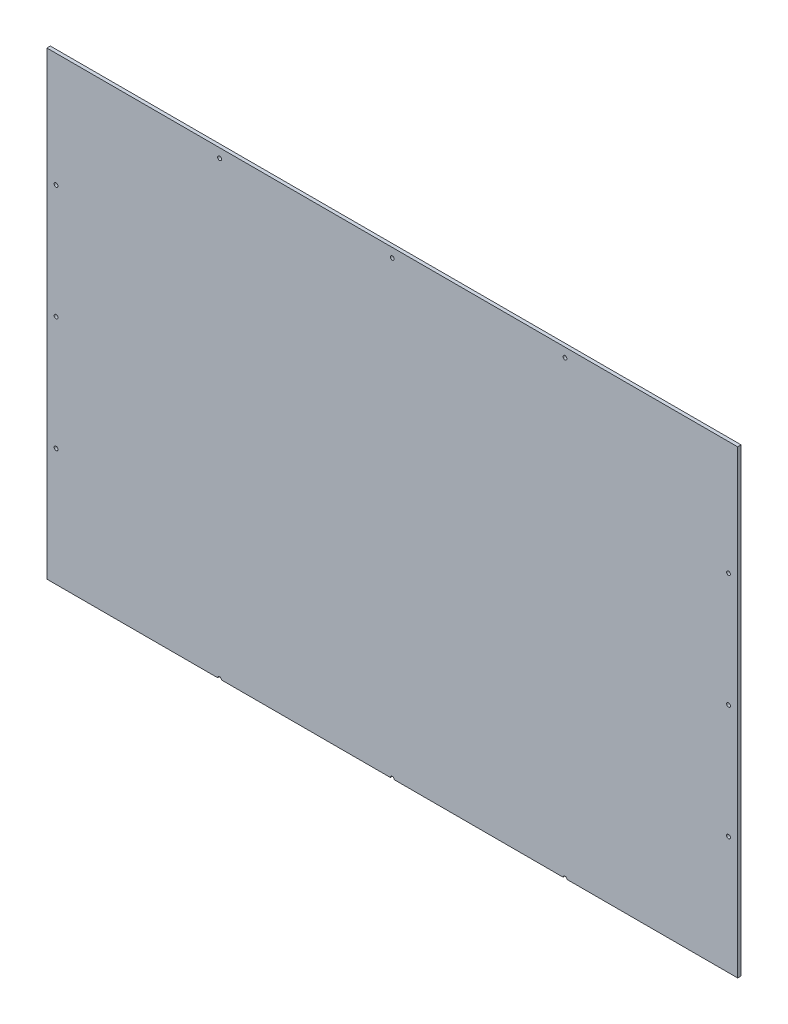
ISO-10303-21;
HEADER;
FILE_DESCRIPTION(('STEP AP214'),'2;1');
FILE_NAME('part.step','',(''),(''),'','','');
FILE_SCHEMA(('AUTOMOTIVE_DESIGN { 1 0 10303 214 1 1 1 1 }'));
ENDSEC;
DATA;
#1=APPLICATION_CONTEXT('core data for automotive mechanical design processes');
#2=APPLICATION_PROTOCOL_DEFINITION('international standard','automotive_design',2000,#1);
#3=PRODUCT_CONTEXT('',#1,'mechanical');
#4=PRODUCT('Part','Part','',(#3));
#5=PRODUCT_RELATED_PRODUCT_CATEGORY('part','',(#4));
#6=PRODUCT_DEFINITION_FORMATION('','',#4);
#7=PRODUCT_DEFINITION_CONTEXT('part definition',#1,'design');
#8=PRODUCT_DEFINITION('design','',#6,#7);
#9=PRODUCT_DEFINITION_SHAPE('','',#8);
#10=(LENGTH_UNIT() NAMED_UNIT(*) SI_UNIT(.MILLI.,.METRE.));
#11=(NAMED_UNIT(*) PLANE_ANGLE_UNIT() SI_UNIT($,.RADIAN.));
#12=(NAMED_UNIT(*) SI_UNIT($,.STERADIAN.) SOLID_ANGLE_UNIT());
#13=UNCERTAINTY_MEASURE_WITH_UNIT(LENGTH_MEASURE(1.E-05),#10,'distance_accuracy_value','');
#14=(GEOMETRIC_REPRESENTATION_CONTEXT(3) GLOBAL_UNCERTAINTY_ASSIGNED_CONTEXT((#13)) GLOBAL_UNIT_ASSIGNED_CONTEXT((#10,
#11,#12)) REPRESENTATION_CONTEXT('',''));
#15=CARTESIAN_POINT('',(0.,0.,0.));
#16=DIRECTION('',(0.,0.,1.));
#17=DIRECTION('',(1.,0.,0.));
#18=AXIS2_PLACEMENT_3D('',#15,#16,#17);
#19=CARTESIAN_POINT('',(-452.,298.5,4.5));
#20=DIRECTION('',(1.,0.,0.));
#21=DIRECTION('',(0.,1.,0.));
#22=AXIS2_PLACEMENT_3D('',#19,#20,#21);
#23=PLANE('',#22);
#24=DIRECTION('',(0.,-1.,0.));
#25=VECTOR('',#24,1.);
#26=CARTESIAN_POINT('',(-452.,298.5,0.));
#27=LINE('',#26,#25);
#28=CARTESIAN_POINT('',(-452.,298.5,0.));
#29=VERTEX_POINT('',#28);
#30=CARTESIAN_POINT('',(-452.,-303.5,0.));
#31=VERTEX_POINT('',#30);
#32=EDGE_CURVE('E154',#29,#31,#27,.T.);
#33=ORIENTED_EDGE('',*,*,#32,.T.);
#34=DIRECTION('',(0.,0.,-1.));
#35=VECTOR('',#34,1.);
#36=CARTESIAN_POINT('',(-452.,-303.5,4.5));
#37=LINE('',#36,#35);
#38=CARTESIAN_POINT('',(-452.,-303.5,4.5));
#39=VERTEX_POINT('',#38);
#40=EDGE_CURVE('E11',#39,#31,#37,.T.);
#41=ORIENTED_EDGE('',*,*,#40,.F.);
#42=DIRECTION('',(0.,-1.,0.));
#43=VECTOR('',#42,1.);
#44=CARTESIAN_POINT('',(-452.,298.5,4.5));
#45=LINE('',#44,#43);
#46=CARTESIAN_POINT('',(-452.,298.5,4.5));
#47=VERTEX_POINT('',#46);
#48=EDGE_CURVE('E190',#47,#39,#45,.T.);
#49=ORIENTED_EDGE('',*,*,#48,.F.);
#50=DIRECTION('',(0.,0.,-1.));
#51=VECTOR('',#50,1.);
#52=CARTESIAN_POINT('',(-452.,298.5,4.5));
#53=LINE('',#52,#51);
#54=EDGE_CURVE('E58',#47,#29,#53,.T.);
#55=ORIENTED_EDGE('',*,*,#54,.T.);
#56=EDGE_LOOP('',(#33,#41,#49,#55));
#57=FACE_BOUND('',#56,.T.);
#58=ADVANCED_FACE('F39',(#57),#23,.F.);
#59=CARTESIAN_POINT('',(-452.,-303.5,4.5));
#60=DIRECTION('',(0.,1.,0.));
#61=DIRECTION('',(-1.,0.,0.));
#62=AXIS2_PLACEMENT_3D('',#59,#60,#61);
#63=PLANE('',#62);
#64=DIRECTION('',(1.,0.,0.));
#65=VECTOR('',#64,1.);
#66=CARTESIAN_POINT('',(-452.,-303.5,0.));
#67=LINE('',#66,#65);
#68=CARTESIAN_POINT('',(-228.5,-303.500000000002,0.));
#69=VERTEX_POINT('',#68);
#70=EDGE_CURVE('E157',#31,#69,#67,.T.);
#71=ORIENTED_EDGE('',*,*,#70,.T.);
#72=DIRECTION('',(0.,0.,-1.));
#73=VECTOR('',#72,1.);
#74=CARTESIAN_POINT('',(-228.5,-303.500000000002,4.5));
#75=LINE('',#74,#73);
#76=CARTESIAN_POINT('',(-228.5,-303.500000000002,4.5));
#77=VERTEX_POINT('',#76);
#78=EDGE_CURVE('E49',#77,#69,#75,.T.);
#79=ORIENTED_EDGE('',*,*,#78,.F.);
#80=DIRECTION('',(1.,0.,0.));
#81=VECTOR('',#80,1.);
#82=CARTESIAN_POINT('',(-452.,-303.5,4.5));
#83=LINE('',#82,#81);
#84=EDGE_CURVE('E102',#39,#77,#83,.T.);
#85=ORIENTED_EDGE('',*,*,#84,.F.);
#86=ORIENTED_EDGE('',*,*,#40,.T.);
#87=EDGE_LOOP('',(#71,#79,#85,#86));
#88=FACE_BOUND('',#87,.T.);
#89=ADVANCED_FACE('F264',(#88),#63,.F.);
#90=CARTESIAN_POINT('',(-226.,-303.500000000002,4.5));
#91=DIRECTION('',(0.,0.,-1.));
#92=DIRECTION('',(-1.,0.,0.));
#93=AXIS2_PLACEMENT_3D('',#90,#91,#92);
#94=CYLINDRICAL_SURFACE('',#93,2.5);
#95=CARTESIAN_POINT('',(-226.,-303.500000000002,0.));
#96=DIRECTION('',(0.,0.,1.));
#97=DIRECTION('',(1.,0.,0.));
#98=AXIS2_PLACEMENT_3D('',#95,#96,#97);
#99=CIRCLE('',#98,2.5);
#100=CARTESIAN_POINT('',(-223.5,-303.5,0.));
#101=VERTEX_POINT('',#100);
#102=EDGE_CURVE('E161',#101,#69,#99,.T.);
#103=ORIENTED_EDGE('',*,*,#102,.F.);
#104=DIRECTION('',(0.,0.,-1.));
#105=VECTOR('',#104,1.);
#106=CARTESIAN_POINT('',(-223.5,-303.5,4.5));
#107=LINE('',#106,#105);
#108=CARTESIAN_POINT('',(-223.5,-303.5,4.5));
#109=VERTEX_POINT('',#108);
#110=EDGE_CURVE('E206',#109,#101,#107,.T.);
#111=ORIENTED_EDGE('',*,*,#110,.F.);
#112=CARTESIAN_POINT('',(-226.,-303.500000000002,4.5));
#113=DIRECTION('',(0.,0.,1.));
#114=DIRECTION('',(1.,0.,0.));
#115=AXIS2_PLACEMENT_3D('',#112,#113,#114);
#116=CIRCLE('',#115,2.5);
#117=EDGE_CURVE('E318',#109,#77,#116,.T.);
#118=ORIENTED_EDGE('',*,*,#117,.T.);
#119=ORIENTED_EDGE('',*,*,#78,.T.);
#120=EDGE_LOOP('',(#103,#111,#118,#119));
#121=FACE_BOUND('',#120,.T.);
#122=ADVANCED_FACE('F268',(#121),#94,.F.);
#123=CARTESIAN_POINT('',(-223.5,-303.5,4.5));
#124=DIRECTION('',(0.,1.,0.));
#125=DIRECTION('',(0.,0.,1.));
#126=AXIS2_PLACEMENT_3D('',#123,#124,#125);
#127=PLANE('',#126);
#128=DIRECTION('',(1.,0.,0.));
#129=VECTOR('',#128,1.);
#130=CARTESIAN_POINT('',(-223.5,-303.5,0.));
#131=LINE('',#130,#129);
#132=CARTESIAN_POINT('',(-2.5,-303.5,0.));
#133=VERTEX_POINT('',#132);
#134=EDGE_CURVE('E165',#101,#133,#131,.T.);
#135=ORIENTED_EDGE('',*,*,#134,.T.);
#136=DIRECTION('',(0.,0.,-1.));
#137=VECTOR('',#136,1.);
#138=CARTESIAN_POINT('',(-2.5,-303.5,4.5));
#139=LINE('',#138,#137);
#140=CARTESIAN_POINT('',(-2.5,-303.5,4.5));
#141=VERTEX_POINT('',#140);
#142=EDGE_CURVE('E203',#141,#133,#139,.T.);
#143=ORIENTED_EDGE('',*,*,#142,.F.);
#144=DIRECTION('',(1.,0.,0.));
#145=VECTOR('',#144,1.);
#146=CARTESIAN_POINT('',(-223.5,-303.5,4.5));
#147=LINE('',#146,#145);
#148=EDGE_CURVE('E313',#109,#141,#147,.T.);
#149=ORIENTED_EDGE('',*,*,#148,.F.);
#150=ORIENTED_EDGE('',*,*,#110,.T.);
#151=EDGE_LOOP('',(#135,#143,#149,#150));
#152=FACE_BOUND('',#151,.T.);
#153=ADVANCED_FACE('F296',(#152),#127,.F.);
#154=CARTESIAN_POINT('',(0.,-303.5,4.5));
#155=DIRECTION('',(0.,0.,-1.));
#156=DIRECTION('',(-1.,0.,0.));
#157=AXIS2_PLACEMENT_3D('',#154,#155,#156);
#158=CYLINDRICAL_SURFACE('',#157,2.5);
#159=CARTESIAN_POINT('',(0.,-303.5,0.));
#160=DIRECTION('',(0.,0.,1.));
#161=DIRECTION('',(1.,0.,0.));
#162=AXIS2_PLACEMENT_3D('',#159,#160,#161);
#163=CIRCLE('',#162,2.5);
#164=CARTESIAN_POINT('',(2.5,-303.499999999998,0.));
#165=VERTEX_POINT('',#164);
#166=EDGE_CURVE('E169',#165,#133,#163,.T.);
#167=ORIENTED_EDGE('',*,*,#166,.F.);
#168=DIRECTION('',(0.,0.,-1.));
#169=VECTOR('',#168,1.);
#170=CARTESIAN_POINT('',(2.5,-303.499999999998,4.5));
#171=LINE('',#170,#169);
#172=CARTESIAN_POINT('',(2.5,-303.499999999998,4.5));
#173=VERTEX_POINT('',#172);
#174=EDGE_CURVE('E200',#173,#165,#171,.T.);
#175=ORIENTED_EDGE('',*,*,#174,.F.);
#176=CARTESIAN_POINT('',(0.,-303.5,4.5));
#177=DIRECTION('',(0.,0.,1.));
#178=DIRECTION('',(1.,0.,0.));
#179=AXIS2_PLACEMENT_3D('',#176,#177,#178);
#180=CIRCLE('',#179,2.5);
#181=EDGE_CURVE('E317',#173,#141,#180,.T.);
#182=ORIENTED_EDGE('',*,*,#181,.T.);
#183=ORIENTED_EDGE('',*,*,#142,.T.);
#184=EDGE_LOOP('',(#167,#175,#182,#183));
#185=FACE_BOUND('',#184,.T.);
#186=ADVANCED_FACE('F292',(#185),#158,.F.);
#187=CARTESIAN_POINT('',(2.5,-303.499999999998,4.5));
#188=DIRECTION('',(0.,1.,0.));
#189=DIRECTION('',(-1.,0.,0.));
#190=AXIS2_PLACEMENT_3D('',#187,#188,#189);
#191=PLANE('',#190);
#192=DIRECTION('',(1.,0.,0.));
#193=VECTOR('',#192,1.);
#194=CARTESIAN_POINT('',(2.5,-303.499999999998,0.));
#195=LINE('',#194,#193);
#196=CARTESIAN_POINT('',(223.5,-303.5,0.));
#197=VERTEX_POINT('',#196);
#198=EDGE_CURVE('E173',#165,#197,#195,.T.);
#199=ORIENTED_EDGE('',*,*,#198,.T.);
#200=DIRECTION('',(0.,0.,-1.));
#201=VECTOR('',#200,1.);
#202=CARTESIAN_POINT('',(223.5,-303.5,4.5));
#203=LINE('',#202,#201);
#204=CARTESIAN_POINT('',(223.5,-303.5,4.5));
#205=VERTEX_POINT('',#204);
#206=EDGE_CURVE('E197',#205,#197,#203,.T.);
#207=ORIENTED_EDGE('',*,*,#206,.F.);
#208=DIRECTION('',(1.,0.,0.));
#209=VECTOR('',#208,1.);
#210=CARTESIAN_POINT('',(2.5,-303.499999999998,4.5));
#211=LINE('',#210,#209);
#212=EDGE_CURVE('E328',#173,#205,#211,.T.);
#213=ORIENTED_EDGE('',*,*,#212,.F.);
#214=ORIENTED_EDGE('',*,*,#174,.T.);
#215=EDGE_LOOP('',(#199,#207,#213,#214));
#216=FACE_BOUND('',#215,.T.);
#217=ADVANCED_FACE('F288',(#216),#191,.F.);
#218=CARTESIAN_POINT('',(226.,-303.5,4.5));
#219=DIRECTION('',(0.,0.,-1.));
#220=DIRECTION('',(-1.,0.,0.));
#221=AXIS2_PLACEMENT_3D('',#218,#219,#220);
#222=CYLINDRICAL_SURFACE('',#221,2.5);
#223=CARTESIAN_POINT('',(226.,-303.5,0.));
#224=DIRECTION('',(0.,0.,1.));
#225=DIRECTION('',(1.,0.,0.));
#226=AXIS2_PLACEMENT_3D('',#223,#224,#225);
#227=CIRCLE('',#226,2.5);
#228=CARTESIAN_POINT('',(228.5,-303.499999999998,0.));
#229=VERTEX_POINT('',#228);
#230=EDGE_CURVE('E177',#229,#197,#227,.T.);
#231=ORIENTED_EDGE('',*,*,#230,.F.);
#232=DIRECTION('',(0.,0.,-1.));
#233=VECTOR('',#232,1.);
#234=CARTESIAN_POINT('',(228.5,-303.499999999998,4.5));
#235=LINE('',#234,#233);
#236=CARTESIAN_POINT('',(228.5,-303.499999999998,4.5));
#237=VERTEX_POINT('',#236);
#238=EDGE_CURVE('E144',#237,#229,#235,.T.);
#239=ORIENTED_EDGE('',*,*,#238,.F.);
#240=CARTESIAN_POINT('',(226.,-303.5,4.5));
#241=DIRECTION('',(0.,0.,1.));
#242=DIRECTION('',(1.,0.,0.));
#243=AXIS2_PLACEMENT_3D('',#240,#241,#242);
#244=CIRCLE('',#243,2.5);
#245=EDGE_CURVE('E132',#237,#205,#244,.T.);
#246=ORIENTED_EDGE('',*,*,#245,.T.);
#247=ORIENTED_EDGE('',*,*,#206,.T.);
#248=EDGE_LOOP('',(#231,#239,#246,#247));
#249=FACE_BOUND('',#248,.T.);
#250=ADVANCED_FACE('F285',(#249),#222,.F.);
#251=CARTESIAN_POINT('',(228.5,-303.499999999998,4.5));
#252=DIRECTION('',(0.,1.,0.));
#253=DIRECTION('',(-1.,0.,0.));
#254=AXIS2_PLACEMENT_3D('',#251,#252,#253);
#255=PLANE('',#254);
#256=DIRECTION('',(1.,0.,0.));
#257=VECTOR('',#256,1.);
#258=CARTESIAN_POINT('',(228.5,-303.499999999998,0.));
#259=LINE('',#258,#257);
#260=CARTESIAN_POINT('',(452.,-303.5,0.));
#261=VERTEX_POINT('',#260);
#262=EDGE_CURVE('E140',#229,#261,#259,.T.);
#263=ORIENTED_EDGE('',*,*,#262,.T.);
#264=DIRECTION('',(0.,0.,-1.));
#265=VECTOR('',#264,1.);
#266=CARTESIAN_POINT('',(452.,-303.5,4.5));
#267=LINE('',#266,#265);
#268=CARTESIAN_POINT('',(452.,-303.5,4.5));
#269=VERTEX_POINT('',#268);
#270=EDGE_CURVE('E137',#269,#261,#267,.T.);
#271=ORIENTED_EDGE('',*,*,#270,.F.);
#272=DIRECTION('',(1.,0.,0.));
#273=VECTOR('',#272,1.);
#274=CARTESIAN_POINT('',(228.5,-303.499999999998,4.5));
#275=LINE('',#274,#273);
#276=EDGE_CURVE('E125',#237,#269,#275,.T.);
#277=ORIENTED_EDGE('',*,*,#276,.F.);
#278=ORIENTED_EDGE('',*,*,#238,.T.);
#279=EDGE_LOOP('',(#263,#271,#277,#278));
#280=FACE_BOUND('',#279,.T.);
#281=ADVANCED_FACE('F138',(#280),#255,.F.);
#282=CARTESIAN_POINT('',(452.,298.5,4.5));
#283=DIRECTION('',(1.,0.,0.));
#284=DIRECTION('',(0.,1.,0.));
#285=AXIS2_PLACEMENT_3D('',#282,#283,#284);
#286=PLANE('',#285);
#287=DIRECTION('',(0.,-1.,0.));
#288=VECTOR('',#287,1.);
#289=CARTESIAN_POINT('',(452.,298.5,0.));
#290=LINE('',#289,#288);
#291=CARTESIAN_POINT('',(452.,298.5,0.));
#292=VERTEX_POINT('',#291);
#293=EDGE_CURVE('E183',#292,#261,#290,.T.);
#294=ORIENTED_EDGE('',*,*,#293,.F.);
#295=DIRECTION('',(0.,0.,-1.));
#296=VECTOR('',#295,1.);
#297=CARTESIAN_POINT('',(452.,298.5,4.5));
#298=LINE('',#297,#296);
#299=CARTESIAN_POINT('',(452.,298.5,4.5));
#300=VERTEX_POINT('',#299);
#301=EDGE_CURVE('E90',#300,#292,#298,.T.);
#302=ORIENTED_EDGE('',*,*,#301,.F.);
#303=DIRECTION('',(0.,-1.,0.));
#304=VECTOR('',#303,1.);
#305=CARTESIAN_POINT('',(452.,298.5,4.5));
#306=LINE('',#305,#304);
#307=EDGE_CURVE('E130',#300,#269,#306,.T.);
#308=ORIENTED_EDGE('',*,*,#307,.T.);
#309=ORIENTED_EDGE('',*,*,#270,.T.);
#310=EDGE_LOOP('',(#294,#302,#308,#309));
#311=FACE_BOUND('',#310,.T.);
#312=ADVANCED_FACE('F146',(#311),#286,.T.);
#313=CARTESIAN_POINT('',(-452.,298.5,4.5));
#314=DIRECTION('',(0.,1.,0.));
#315=DIRECTION('',(0.,0.,1.));
#316=AXIS2_PLACEMENT_3D('',#313,#314,#315);
#317=PLANE('',#316);
#318=DIRECTION('',(1.,0.,0.));
#319=VECTOR('',#318,1.);
#320=CARTESIAN_POINT('',(-452.,298.5,0.));
#321=LINE('',#320,#319);
#322=EDGE_CURVE('E186',#29,#292,#321,.T.);
#323=ORIENTED_EDGE('',*,*,#322,.F.);
#324=ORIENTED_EDGE('',*,*,#54,.F.);
#325=DIRECTION('',(1.,0.,0.));
#326=VECTOR('',#325,1.);
#327=CARTESIAN_POINT('',(-452.,298.5,4.5));
#328=LINE('',#327,#326);
#329=EDGE_CURVE('E148',#47,#300,#328,.T.);
#330=ORIENTED_EDGE('',*,*,#329,.T.);
#331=ORIENTED_EDGE('',*,*,#301,.T.);
#332=EDGE_LOOP('',(#323,#324,#330,#331));
#333=FACE_BOUND('',#332,.T.);
#334=ADVANCED_FACE('F271',(#333),#317,.T.);
#335=CARTESIAN_POINT('',(-226.,-303.500000000002,4.5));
#336=DIRECTION('',(0.,0.,1.));
#337=DIRECTION('',(1.,0.,0.));
#338=AXIS2_PLACEMENT_3D('',#335,#336,#337);
#339=PLANE('',#338);
#340=CARTESIAN_POINT('',(-440.,149.25,4.5));
#341=DIRECTION('',(0.,0.,1.));
#342=DIRECTION('',(1.,0.,0.));
#343=AXIS2_PLACEMENT_3D('',#340,#341,#342);
#344=CIRCLE('',#343,2.50000000000002);
#345=CARTESIAN_POINT('',(-437.5,149.25,4.5));
#346=VERTEX_POINT('',#345);
#347=EDGE_CURVE('E348',#346,#346,#344,.T.);
#348=ORIENTED_EDGE('',*,*,#347,.F.);
#349=EDGE_LOOP('',(#348));
#350=FACE_BOUND('',#349,.T.);
#351=CARTESIAN_POINT('',(-440.,-1.0189061368906E-13,4.5));
#352=DIRECTION('',(0.,0.,1.));
#353=DIRECTION('',(1.,0.,0.));
#354=AXIS2_PLACEMENT_3D('',#351,#352,#353);
#355=CIRCLE('',#354,2.50000000000002);
#356=CARTESIAN_POINT('',(-437.5,-1.0189061368906E-13,4.5));
#357=VERTEX_POINT('',#356);
#358=EDGE_CURVE('E344',#357,#357,#355,.T.);
#359=ORIENTED_EDGE('',*,*,#358,.F.);
#360=EDGE_LOOP('',(#359));
#361=FACE_BOUND('',#360,.T.);
#362=CARTESIAN_POINT('',(0.,286.500000000002,4.5));
#363=DIRECTION('',(0.,0.,1.));
#364=DIRECTION('',(1.,0.,0.));
#365=AXIS2_PLACEMENT_3D('',#362,#363,#364);
#366=CIRCLE('',#365,2.5);
#367=CARTESIAN_POINT('',(2.5,286.500000000002,4.5));
#368=VERTEX_POINT('',#367);
#369=EDGE_CURVE('E340',#368,#368,#366,.T.);
#370=ORIENTED_EDGE('',*,*,#369,.F.);
#371=EDGE_LOOP('',(#370));
#372=FACE_BOUND('',#371,.T.);
#373=CARTESIAN_POINT('',(-440.,-149.25,4.5));
#374=DIRECTION('',(0.,0.,1.));
#375=DIRECTION('',(1.,0.,0.));
#376=AXIS2_PLACEMENT_3D('',#373,#374,#375);
#377=CIRCLE('',#376,2.50000000000002);
#378=CARTESIAN_POINT('',(-437.5,-149.25,4.5));
#379=VERTEX_POINT('',#378);
#380=EDGE_CURVE('E339',#379,#379,#377,.T.);
#381=ORIENTED_EDGE('',*,*,#380,.F.);
#382=EDGE_LOOP('',(#381));
#383=FACE_BOUND('',#382,.T.);
#384=CARTESIAN_POINT('',(440.,149.25,4.5));
#385=DIRECTION('',(0.,0.,1.));
#386=DIRECTION('',(-1.,0.,0.));
#387=AXIS2_PLACEMENT_3D('',#384,#385,#386);
#388=CIRCLE('',#387,2.50000000000002);
#389=CARTESIAN_POINT('',(437.5,149.25,4.5));
#390=VERTEX_POINT('',#389);
#391=EDGE_CURVE('E363',#390,#390,#388,.T.);
#392=ORIENTED_EDGE('',*,*,#391,.F.);
#393=EDGE_LOOP('',(#392));
#394=FACE_BOUND('',#393,.T.);
#395=CARTESIAN_POINT('',(440.,0.,4.5));
#396=DIRECTION('',(0.,0.,1.));
#397=DIRECTION('',(-1.,0.,0.));
#398=AXIS2_PLACEMENT_3D('',#395,#396,#397);
#399=CIRCLE('',#398,2.50000000000002);
#400=CARTESIAN_POINT('',(437.5,0.,4.5));
#401=VERTEX_POINT('',#400);
#402=EDGE_CURVE('E359',#401,#401,#399,.T.);
#403=ORIENTED_EDGE('',*,*,#402,.F.);
#404=EDGE_LOOP('',(#403));
#405=FACE_BOUND('',#404,.T.);
#406=CARTESIAN_POINT('',(440.,-149.25,4.5));
#407=DIRECTION('',(0.,0.,1.));
#408=DIRECTION('',(-1.,0.,0.));
#409=AXIS2_PLACEMENT_3D('',#406,#407,#408);
#410=CIRCLE('',#409,2.50000000000002);
#411=CARTESIAN_POINT('',(437.5,-149.25,4.5));
#412=VERTEX_POINT('',#411);
#413=EDGE_CURVE('E355',#412,#412,#410,.T.);
#414=ORIENTED_EDGE('',*,*,#413,.F.);
#415=EDGE_LOOP('',(#414));
#416=FACE_BOUND('',#415,.T.);
#417=CARTESIAN_POINT('',(-226.,286.5,4.5));
#418=DIRECTION('',(0.,0.,1.));
#419=DIRECTION('',(1.,0.,0.));
#420=AXIS2_PLACEMENT_3D('',#417,#418,#419);
#421=CIRCLE('',#420,2.5);
#422=CARTESIAN_POINT('',(-223.5,286.5,4.5));
#423=VERTEX_POINT('',#422);
#424=EDGE_CURVE('E351',#423,#423,#421,.T.);
#425=ORIENTED_EDGE('',*,*,#424,.F.);
#426=EDGE_LOOP('',(#425));
#427=FACE_BOUND('',#426,.T.);
#428=CARTESIAN_POINT('',(226.,286.500000000002,4.5));
#429=DIRECTION('',(0.,0.,1.));
#430=DIRECTION('',(1.,0.,0.));
#431=AXIS2_PLACEMENT_3D('',#428,#429,#430);
#432=CIRCLE('',#431,2.5);
#433=CARTESIAN_POINT('',(228.5,286.500000000002,4.5));
#434=VERTEX_POINT('',#433);
#435=EDGE_CURVE('E216',#434,#434,#432,.T.);
#436=ORIENTED_EDGE('',*,*,#435,.F.);
#437=EDGE_LOOP('',(#436));
#438=FACE_BOUND('',#437,.T.);
#439=ORIENTED_EDGE('',*,*,#48,.T.);
#440=ORIENTED_EDGE('',*,*,#84,.T.);
#441=ORIENTED_EDGE('',*,*,#117,.F.);
#442=ORIENTED_EDGE('',*,*,#148,.T.);
#443=ORIENTED_EDGE('',*,*,#181,.F.);
#444=ORIENTED_EDGE('',*,*,#212,.T.);
#445=ORIENTED_EDGE('',*,*,#245,.F.);
#446=ORIENTED_EDGE('',*,*,#276,.T.);
#447=ORIENTED_EDGE('',*,*,#307,.F.);
#448=ORIENTED_EDGE('',*,*,#329,.F.);
#449=EDGE_LOOP('',(#439,#440,#441,#442,#443,#444,#445,#446,#447,#448));
#450=FACE_BOUND('',#449,.T.);
#451=ADVANCED_FACE('F127',(#350,#361,#372,#383,#394,#405,#416,#427,#438,#450),#339,.T.);
#452=CARTESIAN_POINT('',(-226.,-303.500000000002,0.));
#453=DIRECTION('',(0.,0.,1.));
#454=DIRECTION('',(1.,0.,0.));
#455=AXIS2_PLACEMENT_3D('',#452,#453,#454);
#456=PLANE('',#455);
#457=CARTESIAN_POINT('',(-440.,149.25,0.));
#458=DIRECTION('',(0.,0.,1.));
#459=DIRECTION('',(1.,0.,0.));
#460=AXIS2_PLACEMENT_3D('',#457,#458,#459);
#461=CIRCLE('',#460,2.50000000000002);
#462=CARTESIAN_POINT('',(-437.5,149.25,0.));
#463=VERTEX_POINT('',#462);
#464=EDGE_CURVE('E42',#463,#463,#461,.T.);
#465=ORIENTED_EDGE('',*,*,#464,.T.);
#466=EDGE_LOOP('',(#465));
#467=FACE_BOUND('',#466,.T.);
#468=CARTESIAN_POINT('',(-440.,-1.0189061368906E-13,0.));
#469=DIRECTION('',(0.,0.,1.));
#470=DIRECTION('',(1.,0.,0.));
#471=AXIS2_PLACEMENT_3D('',#468,#469,#470);
#472=CIRCLE('',#471,2.50000000000002);
#473=CARTESIAN_POINT('',(-437.5,-1.0189061368906E-13,0.));
#474=VERTEX_POINT('',#473);
#475=EDGE_CURVE('E239',#474,#474,#472,.T.);
#476=ORIENTED_EDGE('',*,*,#475,.T.);
#477=EDGE_LOOP('',(#476));
#478=FACE_BOUND('',#477,.T.);
#479=CARTESIAN_POINT('',(0.,286.500000000002,0.));
#480=DIRECTION('',(0.,0.,1.));
#481=DIRECTION('',(1.,0.,0.));
#482=AXIS2_PLACEMENT_3D('',#479,#480,#481);
#483=CIRCLE('',#482,2.5);
#484=CARTESIAN_POINT('',(2.5,286.500000000002,0.));
#485=VERTEX_POINT('',#484);
#486=EDGE_CURVE('E236',#485,#485,#483,.T.);
#487=ORIENTED_EDGE('',*,*,#486,.T.);
#488=EDGE_LOOP('',(#487));
#489=FACE_BOUND('',#488,.T.);
#490=CARTESIAN_POINT('',(-440.,-149.25,0.));
#491=DIRECTION('',(0.,0.,1.));
#492=DIRECTION('',(1.,0.,0.));
#493=AXIS2_PLACEMENT_3D('',#490,#491,#492);
#494=CIRCLE('',#493,2.50000000000002);
#495=CARTESIAN_POINT('',(-437.5,-149.25,0.));
#496=VERTEX_POINT('',#495);
#497=EDGE_CURVE('E232',#496,#496,#494,.T.);
#498=ORIENTED_EDGE('',*,*,#497,.T.);
#499=EDGE_LOOP('',(#498));
#500=FACE_BOUND('',#499,.T.);
#501=CARTESIAN_POINT('',(440.,149.25,0.));
#502=DIRECTION('',(0.,0.,1.));
#503=DIRECTION('',(1.,0.,0.));
#504=AXIS2_PLACEMENT_3D('',#501,#502,#503);
#505=CIRCLE('',#504,2.50000000000002);
#506=CARTESIAN_POINT('',(442.5,149.25,0.));
#507=VERTEX_POINT('',#506);
#508=EDGE_CURVE('E228',#507,#507,#505,.T.);
#509=ORIENTED_EDGE('',*,*,#508,.T.);
#510=EDGE_LOOP('',(#509));
#511=FACE_BOUND('',#510,.T.);
#512=CARTESIAN_POINT('',(440.,0.,0.));
#513=DIRECTION('',(0.,0.,1.));
#514=DIRECTION('',(1.,0.,0.));
#515=AXIS2_PLACEMENT_3D('',#512,#513,#514);
#516=CIRCLE('',#515,2.50000000000002);
#517=CARTESIAN_POINT('',(442.5,0.,0.));
#518=VERTEX_POINT('',#517);
#519=EDGE_CURVE('E224',#518,#518,#516,.T.);
#520=ORIENTED_EDGE('',*,*,#519,.T.);
#521=EDGE_LOOP('',(#520));
#522=FACE_BOUND('',#521,.T.);
#523=CARTESIAN_POINT('',(440.,-149.25,0.));
#524=DIRECTION('',(0.,0.,1.));
#525=DIRECTION('',(1.,0.,0.));
#526=AXIS2_PLACEMENT_3D('',#523,#524,#525);
#527=CIRCLE('',#526,2.50000000000002);
#528=CARTESIAN_POINT('',(442.5,-149.25,0.));
#529=VERTEX_POINT('',#528);
#530=EDGE_CURVE('E220',#529,#529,#527,.T.);
#531=ORIENTED_EDGE('',*,*,#530,.T.);
#532=EDGE_LOOP('',(#531));
#533=FACE_BOUND('',#532,.T.);
#534=CARTESIAN_POINT('',(-226.,286.5,0.));
#535=DIRECTION('',(0.,0.,1.));
#536=DIRECTION('',(1.,0.,0.));
#537=AXIS2_PLACEMENT_3D('',#534,#535,#536);
#538=CIRCLE('',#537,2.5);
#539=CARTESIAN_POINT('',(-223.5,286.5,0.));
#540=VERTEX_POINT('',#539);
#541=EDGE_CURVE('E215',#540,#540,#538,.T.);
#542=ORIENTED_EDGE('',*,*,#541,.T.);
#543=EDGE_LOOP('',(#542));
#544=FACE_BOUND('',#543,.T.);
#545=CARTESIAN_POINT('',(226.,286.500000000002,0.));
#546=DIRECTION('',(0.,0.,1.));
#547=DIRECTION('',(1.,0.,0.));
#548=AXIS2_PLACEMENT_3D('',#545,#546,#547);
#549=CIRCLE('',#548,2.5);
#550=CARTESIAN_POINT('',(228.5,286.500000000002,0.));
#551=VERTEX_POINT('',#550);
#552=EDGE_CURVE('E211',#551,#551,#549,.T.);
#553=ORIENTED_EDGE('',*,*,#552,.T.);
#554=EDGE_LOOP('',(#553));
#555=FACE_BOUND('',#554,.T.);
#556=ORIENTED_EDGE('',*,*,#32,.F.);
#557=ORIENTED_EDGE('',*,*,#322,.T.);
#558=ORIENTED_EDGE('',*,*,#293,.T.);
#559=ORIENTED_EDGE('',*,*,#262,.F.);
#560=ORIENTED_EDGE('',*,*,#230,.T.);
#561=ORIENTED_EDGE('',*,*,#198,.F.);
#562=ORIENTED_EDGE('',*,*,#166,.T.);
#563=ORIENTED_EDGE('',*,*,#134,.F.);
#564=ORIENTED_EDGE('',*,*,#102,.T.);
#565=ORIENTED_EDGE('',*,*,#70,.F.);
#566=EDGE_LOOP('',(#556,#557,#558,#559,#560,#561,#562,#563,#564,#565));
#567=FACE_BOUND('',#566,.T.);
#568=ADVANCED_FACE('F248',(#467,#478,#489,#500,#511,#522,#533,#544,#555,#567),#456,.F.);
#569=CARTESIAN_POINT('',(226.,286.500000000002,-5.5));
#570=DIRECTION('',(0.,0.,1.));
#571=DIRECTION('',(1.,0.,0.));
#572=AXIS2_PLACEMENT_3D('',#569,#570,#571);
#573=CYLINDRICAL_SURFACE('',#572,2.5);
#574=ORIENTED_EDGE('',*,*,#435,.T.);
#575=EDGE_LOOP('',(#574));
#576=FACE_BOUND('',#575,.T.);
#577=ORIENTED_EDGE('',*,*,#552,.F.);
#578=EDGE_LOOP('',(#577));
#579=FACE_BOUND('',#578,.T.);
#580=ADVANCED_FACE('F381',(#576,#579),#573,.F.);
#581=CARTESIAN_POINT('',(-226.,286.5,-5.5));
#582=DIRECTION('',(0.,0.,1.));
#583=DIRECTION('',(1.,0.,0.));
#584=AXIS2_PLACEMENT_3D('',#581,#582,#583);
#585=CYLINDRICAL_SURFACE('',#584,2.5);
#586=ORIENTED_EDGE('',*,*,#424,.T.);
#587=EDGE_LOOP('',(#586));
#588=FACE_BOUND('',#587,.T.);
#589=ORIENTED_EDGE('',*,*,#541,.F.);
#590=EDGE_LOOP('',(#589));
#591=FACE_BOUND('',#590,.T.);
#592=ADVANCED_FACE('F384',(#588,#591),#585,.F.);
#593=CARTESIAN_POINT('',(440.,-149.25,-5.5));
#594=DIRECTION('',(0.,0.,1.));
#595=DIRECTION('',(1.,0.,0.));
#596=AXIS2_PLACEMENT_3D('',#593,#594,#595);
#597=CYLINDRICAL_SURFACE('',#596,2.50000000000002);
#598=ORIENTED_EDGE('',*,*,#413,.T.);
#599=EDGE_LOOP('',(#598));
#600=FACE_BOUND('',#599,.T.);
#601=ORIENTED_EDGE('',*,*,#530,.F.);
#602=EDGE_LOOP('',(#601));
#603=FACE_BOUND('',#602,.T.);
#604=ADVANCED_FACE('F403',(#600,#603),#597,.F.);
#605=CARTESIAN_POINT('',(440.,0.,-5.5));
#606=DIRECTION('',(0.,0.,1.));
#607=DIRECTION('',(1.,0.,0.));
#608=AXIS2_PLACEMENT_3D('',#605,#606,#607);
#609=CYLINDRICAL_SURFACE('',#608,2.50000000000002);
#610=ORIENTED_EDGE('',*,*,#402,.T.);
#611=EDGE_LOOP('',(#610));
#612=FACE_BOUND('',#611,.T.);
#613=ORIENTED_EDGE('',*,*,#519,.F.);
#614=EDGE_LOOP('',(#613));
#615=FACE_BOUND('',#614,.T.);
#616=ADVANCED_FACE('F371',(#612,#615),#609,.F.);
#617=CARTESIAN_POINT('',(440.,149.25,-5.5));
#618=DIRECTION('',(0.,0.,1.));
#619=DIRECTION('',(1.,0.,0.));
#620=AXIS2_PLACEMENT_3D('',#617,#618,#619);
#621=CYLINDRICAL_SURFACE('',#620,2.50000000000002);
#622=ORIENTED_EDGE('',*,*,#391,.T.);
#623=EDGE_LOOP('',(#622));
#624=FACE_BOUND('',#623,.T.);
#625=ORIENTED_EDGE('',*,*,#508,.F.);
#626=EDGE_LOOP('',(#625));
#627=FACE_BOUND('',#626,.T.);
#628=ADVANCED_FACE('F418',(#624,#627),#621,.F.);
#629=CARTESIAN_POINT('',(-440.,-149.25,-5.5));
#630=DIRECTION('',(0.,0.,1.));
#631=DIRECTION('',(1.,0.,0.));
#632=AXIS2_PLACEMENT_3D('',#629,#630,#631);
#633=CYLINDRICAL_SURFACE('',#632,2.50000000000002);
#634=ORIENTED_EDGE('',*,*,#380,.T.);
#635=EDGE_LOOP('',(#634));
#636=FACE_BOUND('',#635,.T.);
#637=ORIENTED_EDGE('',*,*,#497,.F.);
#638=EDGE_LOOP('',(#637));
#639=FACE_BOUND('',#638,.T.);
#640=ADVANCED_FACE('F425',(#636,#639),#633,.F.);
#641=CARTESIAN_POINT('',(0.,286.500000000002,-5.5));
#642=DIRECTION('',(0.,0.,1.));
#643=DIRECTION('',(1.,0.,0.));
#644=AXIS2_PLACEMENT_3D('',#641,#642,#643);
#645=CYLINDRICAL_SURFACE('',#644,2.5);
#646=ORIENTED_EDGE('',*,*,#369,.T.);
#647=EDGE_LOOP('',(#646));
#648=FACE_BOUND('',#647,.T.);
#649=ORIENTED_EDGE('',*,*,#486,.F.);
#650=EDGE_LOOP('',(#649));
#651=FACE_BOUND('',#650,.T.);
#652=ADVANCED_FACE('F258',(#648,#651),#645,.F.);
#653=CARTESIAN_POINT('',(-440.,-1.0189061368906E-13,-5.5));
#654=DIRECTION('',(0.,0.,1.));
#655=DIRECTION('',(1.,0.,0.));
#656=AXIS2_PLACEMENT_3D('',#653,#654,#655);
#657=CYLINDRICAL_SURFACE('',#656,2.50000000000002);
#658=ORIENTED_EDGE('',*,*,#358,.T.);
#659=EDGE_LOOP('',(#658));
#660=FACE_BOUND('',#659,.T.);
#661=ORIENTED_EDGE('',*,*,#475,.F.);
#662=EDGE_LOOP('',(#661));
#663=FACE_BOUND('',#662,.T.);
#664=ADVANCED_FACE('F252',(#660,#663),#657,.F.);
#665=CARTESIAN_POINT('',(-440.,149.25,-5.5));
#666=DIRECTION('',(0.,0.,1.));
#667=DIRECTION('',(1.,0.,0.));
#668=AXIS2_PLACEMENT_3D('',#665,#666,#667);
#669=CYLINDRICAL_SURFACE('',#668,2.50000000000002);
#670=ORIENTED_EDGE('',*,*,#347,.T.);
#671=EDGE_LOOP('',(#670));
#672=FACE_BOUND('',#671,.T.);
#673=ORIENTED_EDGE('',*,*,#464,.F.);
#674=EDGE_LOOP('',(#673));
#675=FACE_BOUND('',#674,.T.);
#676=ADVANCED_FACE('F250',(#672,#675),#669,.F.);
#677=CLOSED_SHELL('',(#58,#89,#122,#153,#186,#217,#250,#281,#312,#334,#451,#568,#580,#592,#604,
#616,#628,#640,#652,#664,#676));
#678=MANIFOLD_SOLID_BREP('B2',#677);
#679=ADVANCED_BREP_SHAPE_REPRESENTATION('',(#18,#678),#14);
#680=SHAPE_DEFINITION_REPRESENTATION(#9,#679);
ENDSEC;
END-ISO-10303-21;
